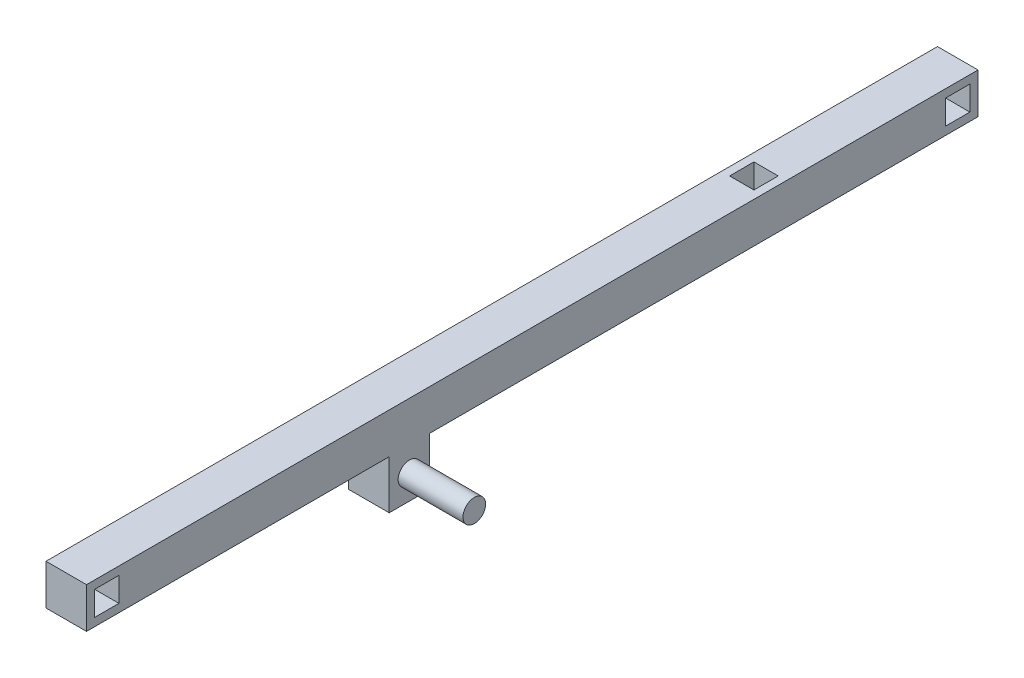
ISO-10303-21;
HEADER;
FILE_DESCRIPTION(('STEP AP214'),'2;1');
FILE_NAME('part.step','',(''),(''),'','','');
FILE_SCHEMA(('AUTOMOTIVE_DESIGN { 1 0 10303 214 1 1 1 1 }'));
ENDSEC;
DATA;
#1=APPLICATION_CONTEXT('core data for automotive mechanical design processes');
#2=APPLICATION_PROTOCOL_DEFINITION('international standard','automotive_design',2000,#1);
#3=PRODUCT_CONTEXT('',#1,'mechanical');
#4=PRODUCT('Part','Part','',(#3));
#5=PRODUCT_RELATED_PRODUCT_CATEGORY('part','',(#4));
#6=PRODUCT_DEFINITION_FORMATION('','',#4);
#7=PRODUCT_DEFINITION_CONTEXT('part definition',#1,'design');
#8=PRODUCT_DEFINITION('design','',#6,#7);
#9=PRODUCT_DEFINITION_SHAPE('','',#8);
#10=(LENGTH_UNIT() NAMED_UNIT(*) SI_UNIT(.MILLI.,.METRE.));
#11=(NAMED_UNIT(*) PLANE_ANGLE_UNIT() SI_UNIT($,.RADIAN.));
#12=(NAMED_UNIT(*) SI_UNIT($,.STERADIAN.) SOLID_ANGLE_UNIT());
#13=UNCERTAINTY_MEASURE_WITH_UNIT(LENGTH_MEASURE(1.E-05),#10,'distance_accuracy_value','');
#14=(GEOMETRIC_REPRESENTATION_CONTEXT(3) GLOBAL_UNCERTAINTY_ASSIGNED_CONTEXT((#13)) GLOBAL_UNIT_ASSIGNED_CONTEXT((#10,
#11,#12)) REPRESENTATION_CONTEXT('',''));
#15=CARTESIAN_POINT('',(0.,0.,0.));
#16=DIRECTION('',(0.,0.,1.));
#17=DIRECTION('',(1.,0.,0.));
#18=AXIS2_PLACEMENT_3D('',#15,#16,#17);
#19=CARTESIAN_POINT('',(0.,0.,110.));
#20=DIRECTION('',(0.,1.,0.));
#21=DIRECTION('',(0.,0.,1.));
#22=AXIS2_PLACEMENT_3D('',#19,#20,#21);
#23=PLANE('',#22);
#24=DIRECTION('',(-1.,0.,0.));
#25=VECTOR('',#24,1.);
#26=CARTESIAN_POINT('',(0.,0.,23.65));
#27=LINE('',#26,#25);
#28=CARTESIAN_POINT('',(4.,0.,23.65));
#29=VERTEX_POINT('',#28);
#30=CARTESIAN_POINT('',(0.999999999999999,0.,23.65));
#31=VERTEX_POINT('',#30);
#32=EDGE_CURVE('E225',#29,#31,#27,.T.);
#33=ORIENTED_EDGE('',*,*,#32,.T.);
#34=DIRECTION('',(0.,0.,1.));
#35=VECTOR('',#34,1.);
#36=CARTESIAN_POINT('',(1.00000000000001,0.,110.));
#37=LINE('',#36,#35);
#38=CARTESIAN_POINT('',(0.999999999999999,0.,26.65));
#39=VERTEX_POINT('',#38);
#40=EDGE_CURVE('E228',#31,#39,#37,.T.);
#41=ORIENTED_EDGE('',*,*,#40,.T.);
#42=DIRECTION('',(1.,0.,0.));
#43=VECTOR('',#42,1.);
#44=CARTESIAN_POINT('',(0.,0.,26.65));
#45=LINE('',#44,#43);
#46=CARTESIAN_POINT('',(4.,0.,26.65));
#47=VERTEX_POINT('',#46);
#48=EDGE_CURVE('E213',#39,#47,#45,.T.);
#49=ORIENTED_EDGE('',*,*,#48,.T.);
#50=DIRECTION('',(0.,0.,-1.));
#51=VECTOR('',#50,1.);
#52=CARTESIAN_POINT('',(4.00000000000005,0.,110.));
#53=LINE('',#52,#51);
#54=EDGE_CURVE('E222',#47,#29,#53,.T.);
#55=ORIENTED_EDGE('',*,*,#54,.T.);
#56=EDGE_LOOP('',(#33,#41,#49,#55));
#57=FACE_BOUND('',#56,.T.);
#58=DIRECTION('',(1.,0.,0.));
#59=VECTOR('',#58,1.);
#60=CARTESIAN_POINT('',(5.,0.,67.65));
#61=LINE('',#60,#59);
#62=CARTESIAN_POINT('',(0.,0.,67.65));
#63=VERTEX_POINT('',#62);
#64=CARTESIAN_POINT('',(5.,0.,67.65));
#65=VERTEX_POINT('',#64);
#66=EDGE_CURVE('E48',#63,#65,#61,.T.);
#67=ORIENTED_EDGE('',*,*,#66,.F.);
#68=DIRECTION('',(0.,0.,-1.));
#69=VECTOR('',#68,1.);
#70=CARTESIAN_POINT('',(0.,0.,110.));
#71=LINE('',#70,#69);
#72=CARTESIAN_POINT('',(0.,0.,0.));
#73=VERTEX_POINT('',#72);
#74=EDGE_CURVE('E296',#63,#73,#71,.T.);
#75=ORIENTED_EDGE('',*,*,#74,.T.);
#76=DIRECTION('',(1.,0.,0.));
#77=VECTOR('',#76,1.);
#78=CARTESIAN_POINT('',(0.,0.,0.));
#79=LINE('',#78,#77);
#80=CARTESIAN_POINT('',(5.,0.,0.));
#81=VERTEX_POINT('',#80);
#82=EDGE_CURVE('E285',#73,#81,#79,.T.);
#83=ORIENTED_EDGE('',*,*,#82,.T.);
#84=DIRECTION('',(0.,0.,-1.));
#85=VECTOR('',#84,1.);
#86=CARTESIAN_POINT('',(5.,0.,110.));
#87=LINE('',#86,#85);
#88=EDGE_CURVE('E53',#65,#81,#87,.T.);
#89=ORIENTED_EDGE('',*,*,#88,.F.);
#90=EDGE_LOOP('',(#67,#75,#83,#89));
#91=FACE_BOUND('',#90,.T.);
#92=ADVANCED_FACE('F32',(#57,#91),#23,.F.);
#93=DIRECTION('',(-1.,0.,0.));
#94=VECTOR('',#93,1.);
#95=CARTESIAN_POINT('',(5.,0.,72.65));
#96=LINE('',#95,#94);
#97=CARTESIAN_POINT('',(5.,0.,72.65));
#98=VERTEX_POINT('',#97);
#99=CARTESIAN_POINT('',(0.,0.,72.65));
#100=VERTEX_POINT('',#99);
#101=EDGE_CURVE('E430',#98,#100,#96,.T.);
#102=ORIENTED_EDGE('',*,*,#101,.F.);
#103=CARTESIAN_POINT('',(5.,0.,110.));
#104=VERTEX_POINT('',#103);
#105=EDGE_CURVE('E193',#104,#98,#87,.T.);
#106=ORIENTED_EDGE('',*,*,#105,.F.);
#107=DIRECTION('',(1.,0.,0.));
#108=VECTOR('',#107,1.);
#109=CARTESIAN_POINT('',(0.,0.,110.));
#110=LINE('',#109,#108);
#111=CARTESIAN_POINT('',(0.,0.,110.));
#112=VERTEX_POINT('',#111);
#113=EDGE_CURVE('E275',#112,#104,#110,.T.);
#114=ORIENTED_EDGE('',*,*,#113,.F.);
#115=EDGE_CURVE('E297',#112,#100,#71,.T.);
#116=ORIENTED_EDGE('',*,*,#115,.T.);
#117=EDGE_LOOP('',(#102,#106,#114,#116));
#118=FACE_BOUND('',#117,.T.);
#119=ADVANCED_FACE('F351',(#118),#23,.F.);
#120=CARTESIAN_POINT('',(0.,0.,110.));
#121=DIRECTION('',(1.,0.,0.));
#122=DIRECTION('',(0.,0.,-1.));
#123=AXIS2_PLACEMENT_3D('',#120,#121,#122);
#124=PLANE('',#123);
#125=DIRECTION('',(0.,0.,1.));
#126=VECTOR('',#125,1.);
#127=CARTESIAN_POINT('',(0.,1.,1.));
#128=LINE('',#127,#126);
#129=CARTESIAN_POINT('',(0.,1.,1.));
#130=VERTEX_POINT('',#129);
#131=CARTESIAN_POINT('',(0.,1.,4.));
#132=VERTEX_POINT('',#131);
#133=EDGE_CURVE('E234',#130,#132,#128,.T.);
#134=ORIENTED_EDGE('',*,*,#133,.F.);
#135=DIRECTION('',(0.,-1.,0.));
#136=VECTOR('',#135,1.);
#137=CARTESIAN_POINT('',(0.,1.,1.));
#138=LINE('',#137,#136);
#139=CARTESIAN_POINT('',(0.,4.,1.));
#140=VERTEX_POINT('',#139);
#141=EDGE_CURVE('E232',#140,#130,#138,.T.);
#142=ORIENTED_EDGE('',*,*,#141,.F.);
#143=DIRECTION('',(0.,0.,-1.));
#144=VECTOR('',#143,1.);
#145=CARTESIAN_POINT('',(0.,4.,1.));
#146=LINE('',#145,#144);
#147=CARTESIAN_POINT('',(0.,4.,4.));
#148=VERTEX_POINT('',#147);
#149=EDGE_CURVE('E241',#148,#140,#146,.T.);
#150=ORIENTED_EDGE('',*,*,#149,.F.);
#151=DIRECTION('',(0.,1.,0.));
#152=VECTOR('',#151,1.);
#153=CARTESIAN_POINT('',(0.,1.,4.));
#154=LINE('',#153,#152);
#155=EDGE_CURVE('E238',#132,#148,#154,.T.);
#156=ORIENTED_EDGE('',*,*,#155,.F.);
#157=EDGE_LOOP('',(#134,#142,#150,#156));
#158=FACE_BOUND('',#157,.T.);
#159=DIRECTION('',(0.,0.,-1.));
#160=VECTOR('',#159,1.);
#161=CARTESIAN_POINT('',(0.,4.,109.));
#162=LINE('',#161,#160);
#163=CARTESIAN_POINT('',(0.,4.,109.));
#164=VERTEX_POINT('',#163);
#165=CARTESIAN_POINT('',(0.,4.,106.));
#166=VERTEX_POINT('',#165);
#167=EDGE_CURVE('E255',#164,#166,#162,.T.);
#168=ORIENTED_EDGE('',*,*,#167,.F.);
#169=DIRECTION('',(0.,1.,0.));
#170=VECTOR('',#169,1.);
#171=CARTESIAN_POINT('',(0.,4.,109.));
#172=LINE('',#171,#170);
#173=CARTESIAN_POINT('',(0.,1.,109.));
#174=VERTEX_POINT('',#173);
#175=EDGE_CURVE('E231',#174,#164,#172,.T.);
#176=ORIENTED_EDGE('',*,*,#175,.F.);
#177=DIRECTION('',(0.,0.,1.));
#178=VECTOR('',#177,1.);
#179=CARTESIAN_POINT('',(0.,1.,109.));
#180=LINE('',#179,#178);
#181=CARTESIAN_POINT('',(0.,1.,106.));
#182=VERTEX_POINT('',#181);
#183=EDGE_CURVE('E261',#182,#174,#180,.T.);
#184=ORIENTED_EDGE('',*,*,#183,.F.);
#185=DIRECTION('',(0.,-1.,0.));
#186=VECTOR('',#185,1.);
#187=CARTESIAN_POINT('',(0.,4.,106.));
#188=LINE('',#187,#186);
#189=EDGE_CURVE('E258',#166,#182,#188,.T.);
#190=ORIENTED_EDGE('',*,*,#189,.F.);
#191=EDGE_LOOP('',(#168,#176,#184,#190));
#192=FACE_BOUND('',#191,.T.);
#193=DIRECTION('',(0.,-1.,0.));
#194=VECTOR('',#193,1.);
#195=CARTESIAN_POINT('',(0.,0.,0.));
#196=LINE('',#195,#194);
#197=CARTESIAN_POINT('',(0.,5.,0.));
#198=VERTEX_POINT('',#197);
#199=EDGE_CURVE('E247',#198,#73,#196,.T.);
#200=ORIENTED_EDGE('',*,*,#199,.T.);
#201=ORIENTED_EDGE('',*,*,#74,.F.);
#202=DIRECTION('',(0.,1.,0.));
#203=VECTOR('',#202,1.);
#204=CARTESIAN_POINT('',(0.,-6.,67.65));
#205=LINE('',#204,#203);
#206=CARTESIAN_POINT('',(0.,-6.,67.65));
#207=VERTEX_POINT('',#206);
#208=EDGE_CURVE('E198',#207,#63,#205,.T.);
#209=ORIENTED_EDGE('',*,*,#208,.F.);
#210=DIRECTION('',(0.,0.,-1.));
#211=VECTOR('',#210,1.);
#212=CARTESIAN_POINT('',(0.,-6.,67.65));
#213=LINE('',#212,#211);
#214=CARTESIAN_POINT('',(0.,-6.,72.65));
#215=VERTEX_POINT('',#214);
#216=EDGE_CURVE('E178',#215,#207,#213,.T.);
#217=ORIENTED_EDGE('',*,*,#216,.F.);
#218=DIRECTION('',(0.,1.,0.));
#219=VECTOR('',#218,1.);
#220=CARTESIAN_POINT('',(0.,-6.,72.65));
#221=LINE('',#220,#219);
#222=EDGE_CURVE('E175',#215,#100,#221,.T.);
#223=ORIENTED_EDGE('',*,*,#222,.T.);
#224=ORIENTED_EDGE('',*,*,#115,.F.);
#225=DIRECTION('',(0.,-1.,0.));
#226=VECTOR('',#225,1.);
#227=CARTESIAN_POINT('',(0.,0.,110.));
#228=LINE('',#227,#226);
#229=CARTESIAN_POINT('',(0.,5.,110.));
#230=VERTEX_POINT('',#229);
#231=EDGE_CURVE('E272',#230,#112,#228,.T.);
#232=ORIENTED_EDGE('',*,*,#231,.F.);
#233=DIRECTION('',(0.,0.,-1.));
#234=VECTOR('',#233,1.);
#235=CARTESIAN_POINT('',(0.,5.,110.));
#236=LINE('',#235,#234);
#237=EDGE_CURVE('E282',#230,#198,#236,.T.);
#238=ORIENTED_EDGE('',*,*,#237,.T.);
#239=EDGE_LOOP('',(#200,#201,#209,#217,#223,#224,#232,#238));
#240=FACE_BOUND('',#239,.T.);
#241=ADVANCED_FACE('F34',(#158,#192,#240),#124,.F.);
#242=CARTESIAN_POINT('',(5.,0.,110.));
#243=DIRECTION('',(-1.,0.,0.));
#244=DIRECTION('',(0.,0.,1.));
#245=AXIS2_PLACEMENT_3D('',#242,#243,#244);
#246=PLANE('',#245);
#247=CARTESIAN_POINT('',(5.,-3.,70.15));
#248=DIRECTION('',(-1.,0.,0.));
#249=DIRECTION('',(0.,0.,1.));
#250=AXIS2_PLACEMENT_3D('',#247,#248,#249);
#251=CIRCLE('',#250,1.4);
#252=CARTESIAN_POINT('',(5.,-3.,71.55));
#253=VERTEX_POINT('',#252);
#254=EDGE_CURVE('E36',#253,#253,#251,.T.);
#255=ORIENTED_EDGE('',*,*,#254,.T.);
#256=EDGE_LOOP('',(#255));
#257=FACE_BOUND('',#256,.T.);
#258=DIRECTION('',(0.,0.,-1.));
#259=VECTOR('',#258,1.);
#260=CARTESIAN_POINT('',(5.,4.,110.));
#261=LINE('',#260,#259);
#262=CARTESIAN_POINT('',(5.,4.,4.));
#263=VERTEX_POINT('',#262);
#264=CARTESIAN_POINT('',(5.,4.,1.));
#265=VERTEX_POINT('',#264);
#266=EDGE_CURVE('E41',#263,#265,#261,.T.);
#267=ORIENTED_EDGE('',*,*,#266,.T.);
#268=DIRECTION('',(0.,-1.,0.));
#269=VECTOR('',#268,1.);
#270=CARTESIAN_POINT('',(5.,0.,1.));
#271=LINE('',#270,#269);
#272=CARTESIAN_POINT('',(5.,1.,1.));
#273=VERTEX_POINT('',#272);
#274=EDGE_CURVE('E11',#265,#273,#271,.T.);
#275=ORIENTED_EDGE('',*,*,#274,.T.);
#276=DIRECTION('',(0.,0.,1.));
#277=VECTOR('',#276,1.);
#278=CARTESIAN_POINT('',(5.,1.,110.));
#279=LINE('',#278,#277);
#280=CARTESIAN_POINT('',(5.,1.,4.));
#281=VERTEX_POINT('',#280);
#282=EDGE_CURVE('E311',#273,#281,#279,.T.);
#283=ORIENTED_EDGE('',*,*,#282,.T.);
#284=DIRECTION('',(0.,1.,0.));
#285=VECTOR('',#284,1.);
#286=CARTESIAN_POINT('',(5.,0.,4.));
#287=LINE('',#286,#285);
#288=EDGE_CURVE('E314',#281,#263,#287,.T.);
#289=ORIENTED_EDGE('',*,*,#288,.T.);
#290=EDGE_LOOP('',(#267,#275,#283,#289));
#291=FACE_BOUND('',#290,.T.);
#292=DIRECTION('',(0.,0.,1.));
#293=VECTOR('',#292,1.);
#294=CARTESIAN_POINT('',(5.,1.,110.));
#295=LINE('',#294,#293);
#296=CARTESIAN_POINT('',(5.,1.,106.));
#297=VERTEX_POINT('',#296);
#298=CARTESIAN_POINT('',(5.,1.,109.));
#299=VERTEX_POINT('',#298);
#300=EDGE_CURVE('E305',#297,#299,#295,.T.);
#301=ORIENTED_EDGE('',*,*,#300,.T.);
#302=DIRECTION('',(0.,1.,0.));
#303=VECTOR('',#302,1.);
#304=CARTESIAN_POINT('',(5.,0.,109.));
#305=LINE('',#304,#303);
#306=CARTESIAN_POINT('',(5.,4.,109.));
#307=VERTEX_POINT('',#306);
#308=EDGE_CURVE('E308',#299,#307,#305,.T.);
#309=ORIENTED_EDGE('',*,*,#308,.T.);
#310=DIRECTION('',(0.,0.,-1.));
#311=VECTOR('',#310,1.);
#312=CARTESIAN_POINT('',(5.,4.,110.));
#313=LINE('',#312,#311);
#314=CARTESIAN_POINT('',(5.,4.,106.));
#315=VERTEX_POINT('',#314);
#316=EDGE_CURVE('E299',#307,#315,#313,.T.);
#317=ORIENTED_EDGE('',*,*,#316,.T.);
#318=DIRECTION('',(0.,-1.,0.));
#319=VECTOR('',#318,1.);
#320=CARTESIAN_POINT('',(5.,0.,106.));
#321=LINE('',#320,#319);
#322=EDGE_CURVE('E302',#315,#297,#321,.T.);
#323=ORIENTED_EDGE('',*,*,#322,.T.);
#324=EDGE_LOOP('',(#301,#309,#317,#323));
#325=FACE_BOUND('',#324,.T.);
#326=DIRECTION('',(0.,1.,0.));
#327=VECTOR('',#326,1.);
#328=CARTESIAN_POINT('',(5.,0.,0.));
#329=LINE('',#328,#327);
#330=CARTESIAN_POINT('',(5.,5.,0.));
#331=VERTEX_POINT('',#330);
#332=EDGE_CURVE('E287',#81,#331,#329,.T.);
#333=ORIENTED_EDGE('',*,*,#332,.T.);
#334=DIRECTION('',(0.,0.,-1.));
#335=VECTOR('',#334,1.);
#336=CARTESIAN_POINT('',(5.,5.,110.));
#337=LINE('',#336,#335);
#338=CARTESIAN_POINT('',(5.,5.,110.));
#339=VERTEX_POINT('',#338);
#340=EDGE_CURVE('E292',#339,#331,#337,.T.);
#341=ORIENTED_EDGE('',*,*,#340,.F.);
#342=DIRECTION('',(0.,1.,0.));
#343=VECTOR('',#342,1.);
#344=CARTESIAN_POINT('',(5.,0.,110.));
#345=LINE('',#344,#343);
#346=EDGE_CURVE('E278',#104,#339,#345,.T.);
#347=ORIENTED_EDGE('',*,*,#346,.F.);
#348=ORIENTED_EDGE('',*,*,#105,.T.);
#349=DIRECTION('',(0.,1.,0.));
#350=VECTOR('',#349,1.);
#351=CARTESIAN_POINT('',(5.,-6.,72.65));
#352=LINE('',#351,#350);
#353=CARTESIAN_POINT('',(5.,-6.,72.65));
#354=VERTEX_POINT('',#353);
#355=EDGE_CURVE('E173',#354,#98,#352,.T.);
#356=ORIENTED_EDGE('',*,*,#355,.F.);
#357=DIRECTION('',(0.,0.,1.));
#358=VECTOR('',#357,1.);
#359=CARTESIAN_POINT('',(5.,-6.,67.65));
#360=LINE('',#359,#358);
#361=CARTESIAN_POINT('',(5.,-6.,67.65));
#362=VERTEX_POINT('',#361);
#363=EDGE_CURVE('E179',#362,#354,#360,.T.);
#364=ORIENTED_EDGE('',*,*,#363,.F.);
#365=DIRECTION('',(0.,1.,0.));
#366=VECTOR('',#365,1.);
#367=CARTESIAN_POINT('',(5.,-6.,67.65));
#368=LINE('',#367,#366);
#369=EDGE_CURVE('E434',#362,#65,#368,.T.);
#370=ORIENTED_EDGE('',*,*,#369,.T.);
#371=ORIENTED_EDGE('',*,*,#88,.T.);
#372=EDGE_LOOP('',(#333,#341,#347,#348,#356,#364,#370,#371));
#373=FACE_BOUND('',#372,.T.);
#374=ADVANCED_FACE('F190',(#257,#291,#325,#373),#246,.F.);
#375=CARTESIAN_POINT('',(0.,5.,110.));
#376=DIRECTION('',(0.,-1.,0.));
#377=DIRECTION('',(0.,0.,-1.));
#378=AXIS2_PLACEMENT_3D('',#375,#376,#377);
#379=PLANE('',#378);
#380=DIRECTION('',(1.,0.,0.));
#381=VECTOR('',#380,1.);
#382=CARTESIAN_POINT('',(0.999999999999999,5.,26.65));
#383=LINE('',#382,#381);
#384=CARTESIAN_POINT('',(0.999999999999999,5.,26.65));
#385=VERTEX_POINT('',#384);
#386=CARTESIAN_POINT('',(4.,5.,26.65));
#387=VERTEX_POINT('',#386);
#388=EDGE_CURVE('E196',#385,#387,#383,.T.);
#389=ORIENTED_EDGE('',*,*,#388,.F.);
#390=DIRECTION('',(0.,0.,1.));
#391=VECTOR('',#390,1.);
#392=CARTESIAN_POINT('',(0.999999999999999,5.,23.65));
#393=LINE('',#392,#391);
#394=CARTESIAN_POINT('',(0.999999999999999,5.,23.65));
#395=VERTEX_POINT('',#394);
#396=EDGE_CURVE('E194',#395,#385,#393,.T.);
#397=ORIENTED_EDGE('',*,*,#396,.F.);
#398=DIRECTION('',(-1.,0.,0.));
#399=VECTOR('',#398,1.);
#400=CARTESIAN_POINT('',(0.999999999999999,5.,23.65));
#401=LINE('',#400,#399);
#402=CARTESIAN_POINT('',(4.,5.,23.65));
#403=VERTEX_POINT('',#402);
#404=EDGE_CURVE('E207',#403,#395,#401,.T.);
#405=ORIENTED_EDGE('',*,*,#404,.F.);
#406=DIRECTION('',(0.,0.,-1.));
#407=VECTOR('',#406,1.);
#408=CARTESIAN_POINT('',(4.,5.,23.65));
#409=LINE('',#408,#407);
#410=EDGE_CURVE('E204',#387,#403,#409,.T.);
#411=ORIENTED_EDGE('',*,*,#410,.F.);
#412=EDGE_LOOP('',(#389,#397,#405,#411));
#413=FACE_BOUND('',#412,.T.);
#414=DIRECTION('',(-1.,0.,0.));
#415=VECTOR('',#414,1.);
#416=CARTESIAN_POINT('',(0.,5.,0.));
#417=LINE('',#416,#415);
#418=EDGE_CURVE('E276',#331,#198,#417,.T.);
#419=ORIENTED_EDGE('',*,*,#418,.T.);
#420=ORIENTED_EDGE('',*,*,#237,.F.);
#421=DIRECTION('',(-1.,0.,0.));
#422=VECTOR('',#421,1.);
#423=CARTESIAN_POINT('',(0.,5.,110.));
#424=LINE('',#423,#422);
#425=EDGE_CURVE('E280',#339,#230,#424,.T.);
#426=ORIENTED_EDGE('',*,*,#425,.F.);
#427=ORIENTED_EDGE('',*,*,#340,.T.);
#428=EDGE_LOOP('',(#419,#420,#426,#427));
#429=FACE_BOUND('',#428,.T.);
#430=ADVANCED_FACE('F361',(#413,#429),#379,.F.);
#431=CARTESIAN_POINT('',(0.,0.,110.));
#432=DIRECTION('',(0.,0.,-1.));
#433=DIRECTION('',(-1.,0.,0.));
#434=AXIS2_PLACEMENT_3D('',#431,#432,#433);
#435=PLANE('',#434);
#436=ORIENTED_EDGE('',*,*,#231,.T.);
#437=ORIENTED_EDGE('',*,*,#113,.T.);
#438=ORIENTED_EDGE('',*,*,#346,.T.);
#439=ORIENTED_EDGE('',*,*,#425,.T.);
#440=EDGE_LOOP('',(#436,#437,#438,#439));
#441=FACE_BOUND('',#440,.T.);
#442=ADVANCED_FACE('F365',(#441),#435,.F.);
#443=CARTESIAN_POINT('',(0.,0.,0.));
#444=DIRECTION('',(0.,0.,-1.));
#445=DIRECTION('',(-1.,0.,0.));
#446=AXIS2_PLACEMENT_3D('',#443,#444,#445);
#447=PLANE('',#446);
#448=ORIENTED_EDGE('',*,*,#199,.F.);
#449=ORIENTED_EDGE('',*,*,#418,.F.);
#450=ORIENTED_EDGE('',*,*,#332,.F.);
#451=ORIENTED_EDGE('',*,*,#82,.F.);
#452=EDGE_LOOP('',(#448,#449,#450,#451));
#453=FACE_BOUND('',#452,.T.);
#454=ADVANCED_FACE('F367',(#453),#447,.T.);
#455=CARTESIAN_POINT('',(8.99999999999995,4.,109.));
#456=DIRECTION('',(0.,0.,1.));
#457=DIRECTION('',(1.,0.,0.));
#458=AXIS2_PLACEMENT_3D('',#455,#456,#457);
#459=PLANE('',#458);
#460=DIRECTION('',(-1.,0.,0.));
#461=VECTOR('',#460,1.);
#462=CARTESIAN_POINT('',(8.99999999999995,1.,109.));
#463=LINE('',#462,#461);
#464=EDGE_CURVE('E235',#299,#174,#463,.T.);
#465=ORIENTED_EDGE('',*,*,#464,.T.);
#466=ORIENTED_EDGE('',*,*,#175,.T.);
#467=DIRECTION('',(-1.,0.,0.));
#468=VECTOR('',#467,1.);
#469=CARTESIAN_POINT('',(8.99999999999995,4.,109.));
#470=LINE('',#469,#468);
#471=EDGE_CURVE('E264',#307,#164,#470,.T.);
#472=ORIENTED_EDGE('',*,*,#471,.F.);
#473=ORIENTED_EDGE('',*,*,#308,.F.);
#474=EDGE_LOOP('',(#465,#466,#472,#473));
#475=FACE_BOUND('',#474,.T.);
#476=ADVANCED_FACE('F370',(#475),#459,.F.);
#477=CARTESIAN_POINT('',(8.99999999999995,1.,109.));
#478=DIRECTION('',(0.,-1.,0.));
#479=DIRECTION('',(0.,0.,-1.));
#480=AXIS2_PLACEMENT_3D('',#477,#478,#479);
#481=PLANE('',#480);
#482=DIRECTION('',(-1.,0.,0.));
#483=VECTOR('',#482,1.);
#484=CARTESIAN_POINT('',(8.99999999999995,1.,106.));
#485=LINE('',#484,#483);
#486=EDGE_CURVE('E266',#297,#182,#485,.T.);
#487=ORIENTED_EDGE('',*,*,#486,.T.);
#488=ORIENTED_EDGE('',*,*,#183,.T.);
#489=ORIENTED_EDGE('',*,*,#464,.F.);
#490=ORIENTED_EDGE('',*,*,#300,.F.);
#491=EDGE_LOOP('',(#487,#488,#489,#490));
#492=FACE_BOUND('',#491,.T.);
#493=ADVANCED_FACE('F377',(#492),#481,.F.);
#494=CARTESIAN_POINT('',(8.99999999999995,4.,106.));
#495=DIRECTION('',(0.,0.,-1.));
#496=DIRECTION('',(-1.,0.,0.));
#497=AXIS2_PLACEMENT_3D('',#494,#495,#496);
#498=PLANE('',#497);
#499=DIRECTION('',(-1.,0.,0.));
#500=VECTOR('',#499,1.);
#501=CARTESIAN_POINT('',(8.99999999999995,4.,106.));
#502=LINE('',#501,#500);
#503=EDGE_CURVE('E268',#315,#166,#502,.T.);
#504=ORIENTED_EDGE('',*,*,#503,.T.);
#505=ORIENTED_EDGE('',*,*,#189,.T.);
#506=ORIENTED_EDGE('',*,*,#486,.F.);
#507=ORIENTED_EDGE('',*,*,#322,.F.);
#508=EDGE_LOOP('',(#504,#505,#506,#507));
#509=FACE_BOUND('',#508,.T.);
#510=ADVANCED_FACE('F382',(#509),#498,.F.);
#511=CARTESIAN_POINT('',(8.99999999999995,4.,109.));
#512=DIRECTION('',(0.,1.,0.));
#513=DIRECTION('',(0.,0.,1.));
#514=AXIS2_PLACEMENT_3D('',#511,#512,#513);
#515=PLANE('',#514);
#516=ORIENTED_EDGE('',*,*,#471,.T.);
#517=ORIENTED_EDGE('',*,*,#167,.T.);
#518=ORIENTED_EDGE('',*,*,#503,.F.);
#519=ORIENTED_EDGE('',*,*,#316,.F.);
#520=EDGE_LOOP('',(#516,#517,#518,#519));
#521=FACE_BOUND('',#520,.T.);
#522=ADVANCED_FACE('F379',(#521),#515,.F.);
#523=CARTESIAN_POINT('',(8.99999999999995,1.,1.));
#524=DIRECTION('',(0.,0.,-1.));
#525=DIRECTION('',(-1.,0.,0.));
#526=AXIS2_PLACEMENT_3D('',#523,#524,#525);
#527=PLANE('',#526);
#528=DIRECTION('',(-1.,0.,0.));
#529=VECTOR('',#528,1.);
#530=CARTESIAN_POINT('',(8.99999999999995,4.,1.));
#531=LINE('',#530,#529);
#532=EDGE_CURVE('E245',#265,#140,#531,.T.);
#533=ORIENTED_EDGE('',*,*,#532,.T.);
#534=ORIENTED_EDGE('',*,*,#141,.T.);
#535=DIRECTION('',(-1.,0.,0.));
#536=VECTOR('',#535,1.);
#537=CARTESIAN_POINT('',(8.99999999999995,1.,1.));
#538=LINE('',#537,#536);
#539=EDGE_CURVE('E244',#273,#130,#538,.T.);
#540=ORIENTED_EDGE('',*,*,#539,.F.);
#541=ORIENTED_EDGE('',*,*,#274,.F.);
#542=EDGE_LOOP('',(#533,#534,#540,#541));
#543=FACE_BOUND('',#542,.T.);
#544=ADVANCED_FACE('F335',(#543),#527,.F.);
#545=CARTESIAN_POINT('',(8.99999999999995,4.,1.));
#546=DIRECTION('',(0.,1.,0.));
#547=DIRECTION('',(0.,0.,1.));
#548=AXIS2_PLACEMENT_3D('',#545,#546,#547);
#549=PLANE('',#548);
#550=DIRECTION('',(-1.,0.,0.));
#551=VECTOR('',#550,1.);
#552=CARTESIAN_POINT('',(8.99999999999995,4.,4.));
#553=LINE('',#552,#551);
#554=EDGE_CURVE('E248',#263,#148,#553,.T.);
#555=ORIENTED_EDGE('',*,*,#554,.T.);
#556=ORIENTED_EDGE('',*,*,#149,.T.);
#557=ORIENTED_EDGE('',*,*,#532,.F.);
#558=ORIENTED_EDGE('',*,*,#266,.F.);
#559=EDGE_LOOP('',(#555,#556,#557,#558));
#560=FACE_BOUND('',#559,.T.);
#561=ADVANCED_FACE('F324',(#560),#549,.F.);
#562=CARTESIAN_POINT('',(8.99999999999995,1.,4.));
#563=DIRECTION('',(0.,0.,1.));
#564=DIRECTION('',(1.,0.,0.));
#565=AXIS2_PLACEMENT_3D('',#562,#563,#564);
#566=PLANE('',#565);
#567=DIRECTION('',(-1.,0.,0.));
#568=VECTOR('',#567,1.);
#569=CARTESIAN_POINT('',(8.99999999999995,1.,4.));
#570=LINE('',#569,#568);
#571=EDGE_CURVE('E250',#281,#132,#570,.T.);
#572=ORIENTED_EDGE('',*,*,#571,.T.);
#573=ORIENTED_EDGE('',*,*,#155,.T.);
#574=ORIENTED_EDGE('',*,*,#554,.F.);
#575=ORIENTED_EDGE('',*,*,#288,.F.);
#576=EDGE_LOOP('',(#572,#573,#574,#575));
#577=FACE_BOUND('',#576,.T.);
#578=ADVANCED_FACE('F326',(#577),#566,.F.);
#579=CARTESIAN_POINT('',(8.99999999999995,1.,1.));
#580=DIRECTION('',(0.,-1.,0.));
#581=DIRECTION('',(0.,0.,-1.));
#582=AXIS2_PLACEMENT_3D('',#579,#580,#581);
#583=PLANE('',#582);
#584=ORIENTED_EDGE('',*,*,#539,.T.);
#585=ORIENTED_EDGE('',*,*,#133,.T.);
#586=ORIENTED_EDGE('',*,*,#571,.F.);
#587=ORIENTED_EDGE('',*,*,#282,.F.);
#588=EDGE_LOOP('',(#584,#585,#586,#587));
#589=FACE_BOUND('',#588,.T.);
#590=ADVANCED_FACE('F337',(#589),#583,.F.);
#591=CARTESIAN_POINT('',(0.999999999999999,-3.99999999999995,23.65));
#592=DIRECTION('',(-1.,0.,0.));
#593=DIRECTION('',(0.,0.,1.));
#594=AXIS2_PLACEMENT_3D('',#591,#592,#593);
#595=PLANE('',#594);
#596=DIRECTION('',(0.,1.,0.));
#597=VECTOR('',#596,1.);
#598=CARTESIAN_POINT('',(0.999999999999999,-3.99999999999995,23.65));
#599=LINE('',#598,#597);
#600=EDGE_CURVE('E211',#31,#395,#599,.T.);
#601=ORIENTED_EDGE('',*,*,#600,.T.);
#602=ORIENTED_EDGE('',*,*,#396,.T.);
#603=DIRECTION('',(0.,1.,0.));
#604=VECTOR('',#603,1.);
#605=CARTESIAN_POINT('',(0.999999999999999,-3.99999999999995,26.65));
#606=LINE('',#605,#604);
#607=EDGE_CURVE('E210',#39,#385,#606,.T.);
#608=ORIENTED_EDGE('',*,*,#607,.F.);
#609=ORIENTED_EDGE('',*,*,#40,.F.);
#610=EDGE_LOOP('',(#601,#602,#608,#609));
#611=FACE_BOUND('',#610,.T.);
#612=ADVANCED_FACE('F339',(#611),#595,.F.);
#613=CARTESIAN_POINT('',(0.999999999999999,-3.99999999999995,23.65));
#614=DIRECTION('',(0.,0.,-1.));
#615=DIRECTION('',(-1.,0.,0.));
#616=AXIS2_PLACEMENT_3D('',#613,#614,#615);
#617=PLANE('',#616);
#618=DIRECTION('',(0.,1.,0.));
#619=VECTOR('',#618,1.);
#620=CARTESIAN_POINT('',(4.,-3.99999999999995,23.65));
#621=LINE('',#620,#619);
#622=EDGE_CURVE('E214',#29,#403,#621,.T.);
#623=ORIENTED_EDGE('',*,*,#622,.T.);
#624=ORIENTED_EDGE('',*,*,#404,.T.);
#625=ORIENTED_EDGE('',*,*,#600,.F.);
#626=ORIENTED_EDGE('',*,*,#32,.F.);
#627=EDGE_LOOP('',(#623,#624,#625,#626));
#628=FACE_BOUND('',#627,.T.);
#629=ADVANCED_FACE('F345',(#628),#617,.F.);
#630=CARTESIAN_POINT('',(4.,-3.99999999999995,23.65));
#631=DIRECTION('',(1.,0.,0.));
#632=DIRECTION('',(0.,0.,-1.));
#633=AXIS2_PLACEMENT_3D('',#630,#631,#632);
#634=PLANE('',#633);
#635=DIRECTION('',(0.,1.,0.));
#636=VECTOR('',#635,1.);
#637=CARTESIAN_POINT('',(4.,-3.99999999999995,26.65));
#638=LINE('',#637,#636);
#639=EDGE_CURVE('E216',#47,#387,#638,.T.);
#640=ORIENTED_EDGE('',*,*,#639,.T.);
#641=ORIENTED_EDGE('',*,*,#410,.T.);
#642=ORIENTED_EDGE('',*,*,#622,.F.);
#643=ORIENTED_EDGE('',*,*,#54,.F.);
#644=EDGE_LOOP('',(#640,#641,#642,#643));
#645=FACE_BOUND('',#644,.T.);
#646=ADVANCED_FACE('F400',(#645),#634,.F.);
#647=CARTESIAN_POINT('',(0.999999999999999,-3.99999999999995,26.65));
#648=DIRECTION('',(0.,0.,1.));
#649=DIRECTION('',(1.,0.,0.));
#650=AXIS2_PLACEMENT_3D('',#647,#648,#649);
#651=PLANE('',#650);
#652=ORIENTED_EDGE('',*,*,#607,.T.);
#653=ORIENTED_EDGE('',*,*,#388,.T.);
#654=ORIENTED_EDGE('',*,*,#639,.F.);
#655=ORIENTED_EDGE('',*,*,#48,.F.);
#656=EDGE_LOOP('',(#652,#653,#654,#655));
#657=FACE_BOUND('',#656,.T.);
#658=ADVANCED_FACE('F397',(#657),#651,.F.);
#659=CARTESIAN_POINT('',(5.,-6.,72.65));
#660=DIRECTION('',(0.,0.,-1.));
#661=DIRECTION('',(-1.,0.,0.));
#662=AXIS2_PLACEMENT_3D('',#659,#660,#661);
#663=PLANE('',#662);
#664=ORIENTED_EDGE('',*,*,#101,.T.);
#665=ORIENTED_EDGE('',*,*,#222,.F.);
#666=DIRECTION('',(-1.,0.,0.));
#667=VECTOR('',#666,1.);
#668=CARTESIAN_POINT('',(5.,-6.,72.65));
#669=LINE('',#668,#667);
#670=EDGE_CURVE('E168',#354,#215,#669,.T.);
#671=ORIENTED_EDGE('',*,*,#670,.F.);
#672=ORIENTED_EDGE('',*,*,#355,.T.);
#673=EDGE_LOOP('',(#664,#665,#671,#672));
#674=FACE_BOUND('',#673,.T.);
#675=ADVANCED_FACE('F171',(#674),#663,.F.);
#676=CARTESIAN_POINT('',(5.,-6.,67.65));
#677=DIRECTION('',(0.,0.,1.));
#678=DIRECTION('',(1.,0.,0.));
#679=AXIS2_PLACEMENT_3D('',#676,#677,#678);
#680=PLANE('',#679);
#681=ORIENTED_EDGE('',*,*,#66,.T.);
#682=ORIENTED_EDGE('',*,*,#369,.F.);
#683=DIRECTION('',(1.,0.,0.));
#684=VECTOR('',#683,1.);
#685=CARTESIAN_POINT('',(5.,-6.,67.65));
#686=LINE('',#685,#684);
#687=EDGE_CURVE('E184',#207,#362,#686,.T.);
#688=ORIENTED_EDGE('',*,*,#687,.F.);
#689=ORIENTED_EDGE('',*,*,#208,.T.);
#690=EDGE_LOOP('',(#681,#682,#688,#689));
#691=FACE_BOUND('',#690,.T.);
#692=ADVANCED_FACE('F410',(#691),#680,.F.);
#693=CARTESIAN_POINT('',(0.,-6.,0.));
#694=DIRECTION('',(0.,-1.,0.));
#695=DIRECTION('',(0.,0.,-1.));
#696=AXIS2_PLACEMENT_3D('',#693,#694,#695);
#697=PLANE('',#696);
#698=ORIENTED_EDGE('',*,*,#363,.T.);
#699=ORIENTED_EDGE('',*,*,#670,.T.);
#700=ORIENTED_EDGE('',*,*,#216,.T.);
#701=ORIENTED_EDGE('',*,*,#687,.T.);
#702=EDGE_LOOP('',(#698,#699,#700,#701));
#703=FACE_BOUND('',#702,.T.);
#704=ADVANCED_FACE('F182',(#703),#697,.T.);
#705=CARTESIAN_POINT('',(13.,-3.,70.15));
#706=DIRECTION('',(-1.,0.,0.));
#707=DIRECTION('',(0.,0.,1.));
#708=AXIS2_PLACEMENT_3D('',#705,#706,#707);
#709=CYLINDRICAL_SURFACE('',#708,1.4);
#710=CARTESIAN_POINT('',(13.,-3.,70.15));
#711=DIRECTION('',(-1.,0.,0.));
#712=DIRECTION('',(0.,0.,1.));
#713=AXIS2_PLACEMENT_3D('',#710,#711,#712);
#714=CIRCLE('',#713,1.4);
#715=CARTESIAN_POINT('',(13.,-3.,71.55));
#716=VERTEX_POINT('',#715);
#717=EDGE_CURVE('E427',#716,#716,#714,.T.);
#718=CARTESIAN_POINT('',(13.,-3.,71.55));
#719=CARTESIAN_POINT('',(12.9166666666667,-3.,71.55));
#720=CARTESIAN_POINT('',(12.8333333333333,-3.,71.55));
#721=CARTESIAN_POINT('',(12.6666666666667,-3.,71.55));
#722=CARTESIAN_POINT('',(12.5833333333333,-3.,71.55));
#723=CARTESIAN_POINT('',(12.4166666666667,-3.,71.55));
#724=CARTESIAN_POINT('',(12.3333333333333,-3.,71.55));
#725=CARTESIAN_POINT('',(12.1666666666667,-3.,71.55));
#726=CARTESIAN_POINT('',(12.0833333333333,-3.,71.55));
#727=CARTESIAN_POINT('',(11.9166666666667,-3.,71.55));
#728=CARTESIAN_POINT('',(11.8333333333333,-3.,71.55));
#729=CARTESIAN_POINT('',(11.6666666666667,-3.,71.55));
#730=CARTESIAN_POINT('',(11.5833333333333,-3.,71.55));
#731=CARTESIAN_POINT('',(11.4166666666667,-3.,71.55));
#732=CARTESIAN_POINT('',(11.3333333333333,-3.,71.55));
#733=CARTESIAN_POINT('',(11.1666666666667,-3.,71.55));
#734=CARTESIAN_POINT('',(11.0833333333333,-3.,71.55));
#735=CARTESIAN_POINT('',(10.9166666666667,-3.,71.55));
#736=CARTESIAN_POINT('',(10.8333333333333,-3.,71.55));
#737=CARTESIAN_POINT('',(10.6666666666667,-3.,71.55));
#738=CARTESIAN_POINT('',(10.5833333333333,-3.,71.55));
#739=CARTESIAN_POINT('',(10.4166666666667,-3.,71.55));
#740=CARTESIAN_POINT('',(10.3333333333333,-3.,71.55));
#741=CARTESIAN_POINT('',(10.1666666666667,-3.,71.55));
#742=CARTESIAN_POINT('',(10.0833333333333,-3.,71.55));
#743=CARTESIAN_POINT('',(9.91666666666667,-3.,71.55));
#744=CARTESIAN_POINT('',(9.83333333333333,-3.,71.55));
#745=CARTESIAN_POINT('',(9.66666666666667,-3.,71.55));
#746=CARTESIAN_POINT('',(9.58333333333333,-3.,71.55));
#747=CARTESIAN_POINT('',(9.41666666666667,-3.,71.55));
#748=CARTESIAN_POINT('',(9.33333333333333,-3.,71.55));
#749=CARTESIAN_POINT('',(9.16666666666667,-3.,71.55));
#750=CARTESIAN_POINT('',(9.08333333333333,-3.,71.55));
#751=CARTESIAN_POINT('',(8.91666666666667,-3.,71.55));
#752=CARTESIAN_POINT('',(8.83333333333333,-3.,71.55));
#753=CARTESIAN_POINT('',(8.66666666666667,-3.,71.55));
#754=CARTESIAN_POINT('',(8.58333333333333,-3.,71.55));
#755=CARTESIAN_POINT('',(8.41666666666667,-3.,71.55));
#756=CARTESIAN_POINT('',(8.33333333333333,-3.,71.55));
#757=CARTESIAN_POINT('',(8.16666666666667,-3.,71.55));
#758=CARTESIAN_POINT('',(8.08333333333333,-3.,71.55));
#759=CARTESIAN_POINT('',(7.91666666666667,-3.,71.55));
#760=CARTESIAN_POINT('',(7.83333333333333,-3.,71.55));
#761=CARTESIAN_POINT('',(7.66666666666667,-3.,71.55));
#762=CARTESIAN_POINT('',(7.58333333333333,-3.,71.55));
#763=CARTESIAN_POINT('',(7.41666666666667,-3.,71.55));
#764=CARTESIAN_POINT('',(7.33333333333333,-3.,71.55));
#765=CARTESIAN_POINT('',(7.16666666666667,-3.,71.55));
#766=CARTESIAN_POINT('',(7.08333333333333,-3.,71.55));
#767=CARTESIAN_POINT('',(6.91666666666667,-3.,71.55));
#768=CARTESIAN_POINT('',(6.83333333333333,-3.,71.55));
#769=CARTESIAN_POINT('',(6.66666666666667,-3.,71.55));
#770=CARTESIAN_POINT('',(6.58333333333333,-3.,71.55));
#771=CARTESIAN_POINT('',(6.41666666666667,-3.,71.55));
#772=CARTESIAN_POINT('',(6.33333333333333,-3.,71.55));
#773=CARTESIAN_POINT('',(6.16666666666667,-3.,71.55));
#774=CARTESIAN_POINT('',(6.08333333333333,-3.,71.55));
#775=CARTESIAN_POINT('',(5.91666666666667,-3.,71.55));
#776=CARTESIAN_POINT('',(5.83333333333333,-3.,71.55));
#777=CARTESIAN_POINT('',(5.66666666666667,-3.,71.55));
#778=CARTESIAN_POINT('',(5.58333333333333,-3.,71.55));
#779=CARTESIAN_POINT('',(5.41666666666667,-3.,71.55));
#780=CARTESIAN_POINT('',(5.33333333333333,-3.,71.55));
#781=CARTESIAN_POINT('',(5.16666666666667,-3.,71.55));
#782=CARTESIAN_POINT('',(5.08333333333333,-3.,71.55));
#783=CARTESIAN_POINT('',(5.,-3.,71.55));
#784=B_SPLINE_CURVE_WITH_KNOTS('',3,(#718,#719,#720,#721,#722,#723,#724,#725,#726,#727,#728,
#729,#730,#731,#732,#733,#734,#735,#736,#737,#738,#739,#740,#741,#742,#743,#744,#745,#746,#747,
#748,#749,#750,#751,#752,#753,#754,#755,#756,#757,#758,#759,#760,#761,#762,#763,#764,#765,#766,
#767,#768,#769,#770,#771,#772,#773,#774,#775,#776,#777,#778,#779,#780,#781,#782,#783),
.UNSPECIFIED.,.F.,.F.,(4,2,2,2,2,2,2,2,2,2,2,2,2,2,2,2,2,2,2,2,2,2,2,2,2,2,2,2,2,2,2,2,4),(0.,
0.25,0.5,0.750000000000001,1.,1.25,1.5,1.75,2.,2.25,2.5,2.75,3.,3.25,3.5,3.75,4.,4.25,4.5,4.75,
5.,5.25,5.5,5.75,6.,6.25,6.5,6.75,7.,7.25,7.5,7.75,8.),.UNSPECIFIED.);
#785=EDGE_CURVE('BSEAM416',#716,#253,#784,.T.);
#786=ORIENTED_EDGE('',*,*,#717,.T.);
#787=ORIENTED_EDGE('',*,*,#254,.F.);
#788=ORIENTED_EDGE('',*,*,#785,.T.);
#789=ORIENTED_EDGE('',*,*,#785,.F.);
#790=EDGE_LOOP('',(#786,#788,#787,#789));
#791=FACE_BOUND('',#790,.T.);
#792=ADVANCED_FACE('F416',(#791),#709,.T.);
#793=CARTESIAN_POINT('',(13.,-3.,70.15));
#794=DIRECTION('',(-1.,0.,0.));
#795=DIRECTION('',(0.,0.,1.));
#796=AXIS2_PLACEMENT_3D('',#793,#794,#795);
#797=PLANE('',#796);
#798=ORIENTED_EDGE('',*,*,#717,.F.);
#799=EDGE_LOOP('',(#798));
#800=FACE_BOUND('',#799,.T.);
#801=ADVANCED_FACE('F419',(#800),#797,.F.);
#802=CLOSED_SHELL('',(#92,#119,#241,#374,#430,#442,#454,#476,#493,#510,#522,#544,#561,#578,#590,
#612,#629,#646,#658,#675,#692,#704,#792,#801));
#803=MANIFOLD_SOLID_BREP('B2',#802);
#804=ADVANCED_BREP_SHAPE_REPRESENTATION('',(#18,#803),#14);
#805=SHAPE_DEFINITION_REPRESENTATION(#9,#804);
ENDSEC;
END-ISO-10303-21;
